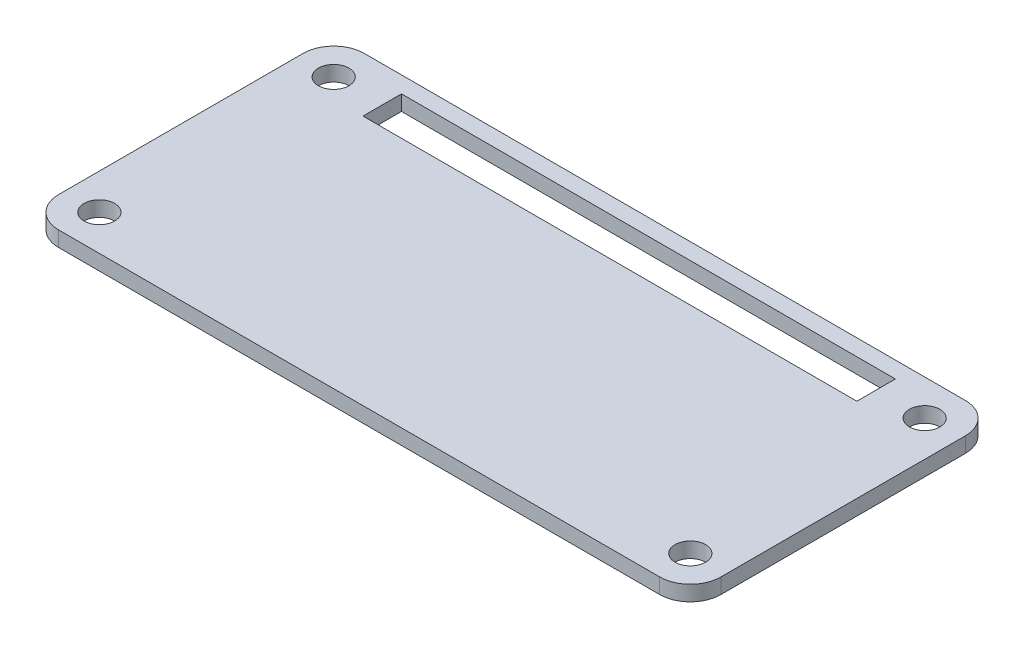
ISO-10303-21;
HEADER;
FILE_DESCRIPTION(('STEP AP214'),'2;1');
FILE_NAME('part.step','',(''),(''),'','','');
FILE_SCHEMA(('AUTOMOTIVE_DESIGN { 1 0 10303 214 1 1 1 1 }'));
ENDSEC;
DATA;
#1=APPLICATION_CONTEXT('core data for automotive mechanical design processes');
#2=APPLICATION_PROTOCOL_DEFINITION('international standard','automotive_design',2000,#1);
#3=PRODUCT_CONTEXT('',#1,'mechanical');
#4=PRODUCT('Part','Part','',(#3));
#5=PRODUCT_RELATED_PRODUCT_CATEGORY('part','',(#4));
#6=PRODUCT_DEFINITION_FORMATION('','',#4);
#7=PRODUCT_DEFINITION_CONTEXT('part definition',#1,'design');
#8=PRODUCT_DEFINITION('design','',#6,#7);
#9=PRODUCT_DEFINITION_SHAPE('','',#8);
#10=(LENGTH_UNIT() NAMED_UNIT(*) SI_UNIT(.MILLI.,.METRE.));
#11=(NAMED_UNIT(*) PLANE_ANGLE_UNIT() SI_UNIT($,.RADIAN.));
#12=(NAMED_UNIT(*) SI_UNIT($,.STERADIAN.) SOLID_ANGLE_UNIT());
#13=UNCERTAINTY_MEASURE_WITH_UNIT(LENGTH_MEASURE(1.E-05),#10,'distance_accuracy_value','');
#14=(GEOMETRIC_REPRESENTATION_CONTEXT(3) GLOBAL_UNCERTAINTY_ASSIGNED_CONTEXT((#13)) GLOBAL_UNIT_ASSIGNED_CONTEXT((#10,
#11,#12)) REPRESENTATION_CONTEXT('',''));
#15=CARTESIAN_POINT('',(0.,0.,0.));
#16=DIRECTION('',(0.,0.,1.));
#17=DIRECTION('',(1.,0.,0.));
#18=AXIS2_PLACEMENT_3D('',#15,#16,#17);
#19=CARTESIAN_POINT('',(29.5,1.5,12.));
#20=DIRECTION('',(0.,1.,0.));
#21=DIRECTION('',(0.,0.,1.));
#22=AXIS2_PLACEMENT_3D('',#19,#20,#21);
#23=PLANE('',#22);
#24=CARTESIAN_POINT('',(29.,1.5,11.5));
#25=DIRECTION('',(0.,1.,0.));
#26=DIRECTION('',(0.,0.,1.));
#27=AXIS2_PLACEMENT_3D('',#24,#25,#26);
#28=CIRCLE('',#27,1.5);
#29=CARTESIAN_POINT('',(29.,1.5,13.));
#30=VERTEX_POINT('',#29);
#31=EDGE_CURVE('E161',#30,#30,#28,.T.);
#32=ORIENTED_EDGE('',*,*,#31,.F.);
#33=EDGE_LOOP('',(#32));
#34=FACE_BOUND('',#33,.T.);
#35=CARTESIAN_POINT('',(-29.,1.5,-11.5));
#36=DIRECTION('',(0.,1.,0.));
#37=DIRECTION('',(0.,0.,1.));
#38=AXIS2_PLACEMENT_3D('',#35,#36,#37);
#39=CIRCLE('',#38,1.5);
#40=CARTESIAN_POINT('',(-29.,1.5,-10.));
#41=VERTEX_POINT('',#40);
#42=EDGE_CURVE('E173',#41,#41,#39,.T.);
#43=ORIENTED_EDGE('',*,*,#42,.F.);
#44=EDGE_LOOP('',(#43));
#45=FACE_BOUND('',#44,.T.);
#46=CARTESIAN_POINT('',(29.5,1.5,12.));
#47=DIRECTION('',(0.,1.,0.));
#48=DIRECTION('',(0.,0.,1.));
#49=AXIS2_PLACEMENT_3D('',#46,#47,#48);
#50=CIRCLE('',#49,3.);
#51=CARTESIAN_POINT('',(29.5,1.5,15.));
#52=VERTEX_POINT('',#51);
#53=CARTESIAN_POINT('',(32.5,1.5,12.));
#54=VERTEX_POINT('',#53);
#55=EDGE_CURVE('E179',#52,#54,#50,.T.);
#56=ORIENTED_EDGE('',*,*,#55,.T.);
#57=DIRECTION('',(0.,0.,-1.));
#58=VECTOR('',#57,1.);
#59=CARTESIAN_POINT('',(32.5,1.5,12.));
#60=LINE('',#59,#58);
#61=CARTESIAN_POINT('',(32.5,1.5,-12.));
#62=VERTEX_POINT('',#61);
#63=EDGE_CURVE('E182',#54,#62,#60,.T.);
#64=ORIENTED_EDGE('',*,*,#63,.T.);
#65=CARTESIAN_POINT('',(29.5,1.5,-12.));
#66=DIRECTION('',(0.,1.,0.));
#67=DIRECTION('',(0.,0.,1.));
#68=AXIS2_PLACEMENT_3D('',#65,#66,#67);
#69=CIRCLE('',#68,3.);
#70=CARTESIAN_POINT('',(29.5,1.5,-15.));
#71=VERTEX_POINT('',#70);
#72=EDGE_CURVE('E185',#62,#71,#69,.T.);
#73=ORIENTED_EDGE('',*,*,#72,.T.);
#74=DIRECTION('',(-1.,0.,0.));
#75=VECTOR('',#74,1.);
#76=CARTESIAN_POINT('',(29.5,1.5,-15.));
#77=LINE('',#76,#75);
#78=CARTESIAN_POINT('',(-29.5,1.5,-15.));
#79=VERTEX_POINT('',#78);
#80=EDGE_CURVE('E187',#71,#79,#77,.T.);
#81=ORIENTED_EDGE('',*,*,#80,.T.);
#82=CARTESIAN_POINT('',(-29.5,1.5,-12.));
#83=DIRECTION('',(0.,1.,0.));
#84=DIRECTION('',(0.,0.,1.));
#85=AXIS2_PLACEMENT_3D('',#82,#83,#84);
#86=CIRCLE('',#85,3.);
#87=CARTESIAN_POINT('',(-32.5,1.5,-12.));
#88=VERTEX_POINT('',#87);
#89=EDGE_CURVE('E189',#79,#88,#86,.T.);
#90=ORIENTED_EDGE('',*,*,#89,.T.);
#91=DIRECTION('',(0.,0.,1.));
#92=VECTOR('',#91,1.);
#93=CARTESIAN_POINT('',(-32.5,1.5,12.));
#94=LINE('',#93,#92);
#95=CARTESIAN_POINT('',(-32.5,1.5,12.));
#96=VERTEX_POINT('',#95);
#97=EDGE_CURVE('E191',#88,#96,#94,.T.);
#98=ORIENTED_EDGE('',*,*,#97,.T.);
#99=CARTESIAN_POINT('',(-29.5,1.5,12.));
#100=DIRECTION('',(0.,1.,0.));
#101=DIRECTION('',(0.,0.,-1.));
#102=AXIS2_PLACEMENT_3D('',#99,#100,#101);
#103=CIRCLE('',#102,3.);
#104=CARTESIAN_POINT('',(-29.5,1.5,15.));
#105=VERTEX_POINT('',#104);
#106=EDGE_CURVE('E193',#96,#105,#103,.T.);
#107=ORIENTED_EDGE('',*,*,#106,.T.);
#108=DIRECTION('',(1.,0.,0.));
#109=VECTOR('',#108,1.);
#110=CARTESIAN_POINT('',(29.5,1.5,15.));
#111=LINE('',#110,#109);
#112=EDGE_CURVE('E195',#105,#52,#111,.T.);
#113=ORIENTED_EDGE('',*,*,#112,.T.);
#114=EDGE_LOOP('',(#56,#64,#73,#81,#90,#98,#107,#113));
#115=FACE_BOUND('',#114,.T.);
#116=CARTESIAN_POINT('',(29.,1.5,-11.5));
#117=DIRECTION('',(0.,1.,0.));
#118=DIRECTION('',(0.,0.,1.));
#119=AXIS2_PLACEMENT_3D('',#116,#117,#118);
#120=CIRCLE('',#119,1.5);
#121=CARTESIAN_POINT('',(29.,1.5,-10.));
#122=VERTEX_POINT('',#121);
#123=EDGE_CURVE('E167',#122,#122,#120,.T.);
#124=ORIENTED_EDGE('',*,*,#123,.F.);
#125=EDGE_LOOP('',(#124));
#126=FACE_BOUND('',#125,.T.);
#127=CARTESIAN_POINT('',(-29.,1.5,11.5));
#128=DIRECTION('',(0.,1.,0.));
#129=DIRECTION('',(0.,0.,1.));
#130=AXIS2_PLACEMENT_3D('',#127,#128,#129);
#131=CIRCLE('',#130,1.5);
#132=CARTESIAN_POINT('',(-29.,1.5,13.));
#133=VERTEX_POINT('',#132);
#134=EDGE_CURVE('E155',#133,#133,#131,.T.);
#135=ORIENTED_EDGE('',*,*,#134,.F.);
#136=EDGE_LOOP('',(#135));
#137=FACE_BOUND('',#136,.T.);
#138=DIRECTION('',(1.,0.,0.));
#139=VECTOR('',#138,1.);
#140=CARTESIAN_POINT('',(24.2351311986602,1.5,-9.61048306153766));
#141=LINE('',#140,#139);
#142=CARTESIAN_POINT('',(-24.2351311986602,1.5,-9.61048306153766));
#143=VERTEX_POINT('',#142);
#144=CARTESIAN_POINT('',(24.2351311986602,1.5,-9.61048306153766));
#145=VERTEX_POINT('',#144);
#146=EDGE_CURVE('E127',#143,#145,#141,.T.);
#147=ORIENTED_EDGE('',*,*,#146,.F.);
#148=DIRECTION('',(0.,0.,1.));
#149=VECTOR('',#148,1.);
#150=CARTESIAN_POINT('',(-24.2351311986602,1.5,-13.3895169384623));
#151=LINE('',#150,#149);
#152=CARTESIAN_POINT('',(-24.2351311986602,1.5,-13.3895169384623));
#153=VERTEX_POINT('',#152);
#154=EDGE_CURVE('E119',#153,#143,#151,.T.);
#155=ORIENTED_EDGE('',*,*,#154,.F.);
#156=DIRECTION('',(-1.,0.,0.));
#157=VECTOR('',#156,1.);
#158=CARTESIAN_POINT('',(24.2351311986602,1.5,-13.3895169384623));
#159=LINE('',#158,#157);
#160=CARTESIAN_POINT('',(24.2351311986602,1.5,-13.3895169384623));
#161=VERTEX_POINT('',#160);
#162=EDGE_CURVE('E141',#161,#153,#159,.T.);
#163=ORIENTED_EDGE('',*,*,#162,.F.);
#164=DIRECTION('',(0.,0.,-1.));
#165=VECTOR('',#164,1.);
#166=CARTESIAN_POINT('',(24.2351311986602,1.5,-13.3895169384623));
#167=LINE('',#166,#165);
#168=EDGE_CURVE('E139',#145,#161,#167,.T.);
#169=ORIENTED_EDGE('',*,*,#168,.F.);
#170=EDGE_LOOP('',(#147,#155,#163,#169));
#171=FACE_BOUND('',#170,.T.);
#172=ADVANCED_FACE('F30',(#34,#45,#115,#126,#137,#171),#23,.T.);
#173=CARTESIAN_POINT('',(29.5,0.,12.));
#174=DIRECTION('',(0.,1.,0.));
#175=DIRECTION('',(0.,0.,1.));
#176=AXIS2_PLACEMENT_3D('',#173,#174,#175);
#177=PLANE('',#176);
#178=CARTESIAN_POINT('',(-29.,0.,11.5));
#179=DIRECTION('',(0.,1.,0.));
#180=DIRECTION('',(0.,0.,1.));
#181=AXIS2_PLACEMENT_3D('',#178,#179,#180);
#182=CIRCLE('',#181,1.5);
#183=CARTESIAN_POINT('',(-29.,0.,13.));
#184=VERTEX_POINT('',#183);
#185=EDGE_CURVE('E135',#184,#184,#182,.T.);
#186=ORIENTED_EDGE('',*,*,#185,.T.);
#187=EDGE_LOOP('',(#186));
#188=FACE_BOUND('',#187,.T.);
#189=CARTESIAN_POINT('',(29.,0.,11.5));
#190=DIRECTION('',(0.,1.,0.));
#191=DIRECTION('',(0.,0.,1.));
#192=AXIS2_PLACEMENT_3D('',#189,#190,#191);
#193=CIRCLE('',#192,1.5);
#194=CARTESIAN_POINT('',(29.,0.,13.));
#195=VERTEX_POINT('',#194);
#196=EDGE_CURVE('E158',#195,#195,#193,.T.);
#197=ORIENTED_EDGE('',*,*,#196,.T.);
#198=EDGE_LOOP('',(#197));
#199=FACE_BOUND('',#198,.T.);
#200=CARTESIAN_POINT('',(29.,0.,-11.5));
#201=DIRECTION('',(0.,1.,0.));
#202=DIRECTION('',(0.,0.,1.));
#203=AXIS2_PLACEMENT_3D('',#200,#201,#202);
#204=CIRCLE('',#203,1.5);
#205=CARTESIAN_POINT('',(29.,0.,-10.));
#206=VERTEX_POINT('',#205);
#207=EDGE_CURVE('E164',#206,#206,#204,.T.);
#208=ORIENTED_EDGE('',*,*,#207,.T.);
#209=EDGE_LOOP('',(#208));
#210=FACE_BOUND('',#209,.T.);
#211=CARTESIAN_POINT('',(-29.,0.,-11.5));
#212=DIRECTION('',(0.,1.,0.));
#213=DIRECTION('',(0.,0.,1.));
#214=AXIS2_PLACEMENT_3D('',#211,#212,#213);
#215=CIRCLE('',#214,1.5);
#216=CARTESIAN_POINT('',(-29.,0.,-10.));
#217=VERTEX_POINT('',#216);
#218=EDGE_CURVE('E170',#217,#217,#215,.T.);
#219=ORIENTED_EDGE('',*,*,#218,.T.);
#220=EDGE_LOOP('',(#219));
#221=FACE_BOUND('',#220,.T.);
#222=CARTESIAN_POINT('',(29.5,0.,12.));
#223=DIRECTION('',(0.,1.,0.));
#224=DIRECTION('',(0.,0.,1.));
#225=AXIS2_PLACEMENT_3D('',#222,#223,#224);
#226=CIRCLE('',#225,3.);
#227=CARTESIAN_POINT('',(29.5,0.,15.));
#228=VERTEX_POINT('',#227);
#229=CARTESIAN_POINT('',(32.5,0.,12.));
#230=VERTEX_POINT('',#229);
#231=EDGE_CURVE('E176',#228,#230,#226,.T.);
#232=ORIENTED_EDGE('',*,*,#231,.F.);
#233=DIRECTION('',(1.,0.,0.));
#234=VECTOR('',#233,1.);
#235=CARTESIAN_POINT('',(29.5,0.,15.));
#236=LINE('',#235,#234);
#237=CARTESIAN_POINT('',(-29.5,0.,15.));
#238=VERTEX_POINT('',#237);
#239=EDGE_CURVE('E183',#238,#228,#236,.T.);
#240=ORIENTED_EDGE('',*,*,#239,.F.);
#241=CARTESIAN_POINT('',(-29.5,0.,12.));
#242=DIRECTION('',(0.,1.,0.));
#243=DIRECTION('',(0.,0.,-1.));
#244=AXIS2_PLACEMENT_3D('',#241,#242,#243);
#245=CIRCLE('',#244,3.);
#246=CARTESIAN_POINT('',(-32.5,0.,12.));
#247=VERTEX_POINT('',#246);
#248=EDGE_CURVE('E210',#247,#238,#245,.T.);
#249=ORIENTED_EDGE('',*,*,#248,.F.);
#250=DIRECTION('',(0.,0.,1.));
#251=VECTOR('',#250,1.);
#252=CARTESIAN_POINT('',(-32.5,0.,12.));
#253=LINE('',#252,#251);
#254=CARTESIAN_POINT('',(-32.5,0.,-12.));
#255=VERTEX_POINT('',#254);
#256=EDGE_CURVE('E208',#255,#247,#253,.T.);
#257=ORIENTED_EDGE('',*,*,#256,.F.);
#258=CARTESIAN_POINT('',(-29.5,0.,-12.));
#259=DIRECTION('',(0.,1.,0.));
#260=DIRECTION('',(0.,0.,1.));
#261=AXIS2_PLACEMENT_3D('',#258,#259,#260);
#262=CIRCLE('',#261,3.);
#263=CARTESIAN_POINT('',(-29.5,0.,-15.));
#264=VERTEX_POINT('',#263);
#265=EDGE_CURVE('E206',#264,#255,#262,.T.);
#266=ORIENTED_EDGE('',*,*,#265,.F.);
#267=DIRECTION('',(-1.,0.,0.));
#268=VECTOR('',#267,1.);
#269=CARTESIAN_POINT('',(29.5,0.,-15.));
#270=LINE('',#269,#268);
#271=CARTESIAN_POINT('',(29.5,0.,-15.));
#272=VERTEX_POINT('',#271);
#273=EDGE_CURVE('E204',#272,#264,#270,.T.);
#274=ORIENTED_EDGE('',*,*,#273,.F.);
#275=CARTESIAN_POINT('',(29.5,0.,-12.));
#276=DIRECTION('',(0.,1.,0.));
#277=DIRECTION('',(0.,0.,1.));
#278=AXIS2_PLACEMENT_3D('',#275,#276,#277);
#279=CIRCLE('',#278,3.);
#280=CARTESIAN_POINT('',(32.5,0.,-12.));
#281=VERTEX_POINT('',#280);
#282=EDGE_CURVE('E202',#281,#272,#279,.T.);
#283=ORIENTED_EDGE('',*,*,#282,.F.);
#284=DIRECTION('',(0.,0.,-1.));
#285=VECTOR('',#284,1.);
#286=CARTESIAN_POINT('',(32.5,0.,12.));
#287=LINE('',#286,#285);
#288=EDGE_CURVE('E200',#230,#281,#287,.T.);
#289=ORIENTED_EDGE('',*,*,#288,.F.);
#290=EDGE_LOOP('',(#232,#240,#249,#257,#266,#274,#283,#289));
#291=FACE_BOUND('',#290,.T.);
#292=DIRECTION('',(0.,0.,1.));
#293=VECTOR('',#292,1.);
#294=CARTESIAN_POINT('',(-24.2351311986602,0.,-13.3895169384623));
#295=LINE('',#294,#293);
#296=CARTESIAN_POINT('',(-24.2351311986602,0.,-13.3895169384623));
#297=VERTEX_POINT('',#296);
#298=CARTESIAN_POINT('',(-24.2351311986602,0.,-9.61048306153766));
#299=VERTEX_POINT('',#298);
#300=EDGE_CURVE('E53',#297,#299,#295,.T.);
#301=ORIENTED_EDGE('',*,*,#300,.T.);
#302=DIRECTION('',(1.,0.,0.));
#303=VECTOR('',#302,1.);
#304=CARTESIAN_POINT('',(24.2351311986602,0.,-9.61048306153766));
#305=LINE('',#304,#303);
#306=CARTESIAN_POINT('',(24.2351311986602,0.,-9.61048306153766));
#307=VERTEX_POINT('',#306);
#308=EDGE_CURVE('E134',#299,#307,#305,.T.);
#309=ORIENTED_EDGE('',*,*,#308,.T.);
#310=DIRECTION('',(0.,0.,-1.));
#311=VECTOR('',#310,1.);
#312=CARTESIAN_POINT('',(24.2351311986602,0.,-13.3895169384623));
#313=LINE('',#312,#311);
#314=CARTESIAN_POINT('',(24.2351311986602,0.,-13.3895169384623));
#315=VERTEX_POINT('',#314);
#316=EDGE_CURVE('E147',#307,#315,#313,.T.);
#317=ORIENTED_EDGE('',*,*,#316,.T.);
#318=DIRECTION('',(-1.,0.,0.));
#319=VECTOR('',#318,1.);
#320=CARTESIAN_POINT('',(24.2351311986602,0.,-13.3895169384623));
#321=LINE('',#320,#319);
#322=EDGE_CURVE('E128',#315,#297,#321,.T.);
#323=ORIENTED_EDGE('',*,*,#322,.T.);
#324=EDGE_LOOP('',(#301,#309,#317,#323));
#325=FACE_BOUND('',#324,.T.);
#326=ADVANCED_FACE('F240',(#188,#199,#210,#221,#291,#325),#177,.F.);
#327=CARTESIAN_POINT('',(29.5,1.5,12.));
#328=DIRECTION('',(0.,-1.,0.));
#329=DIRECTION('',(0.,0.,-1.));
#330=AXIS2_PLACEMENT_3D('',#327,#328,#329);
#331=CYLINDRICAL_SURFACE('',#330,3.);
#332=ORIENTED_EDGE('',*,*,#231,.T.);
#333=DIRECTION('',(0.,-1.,0.));
#334=VECTOR('',#333,1.);
#335=CARTESIAN_POINT('',(32.5,1.5,12.));
#336=LINE('',#335,#334);
#337=EDGE_CURVE('E11',#54,#230,#336,.T.);
#338=ORIENTED_EDGE('',*,*,#337,.F.);
#339=ORIENTED_EDGE('',*,*,#55,.F.);
#340=DIRECTION('',(0.,-1.,0.));
#341=VECTOR('',#340,1.);
#342=CARTESIAN_POINT('',(29.5,1.5,15.));
#343=LINE('',#342,#341);
#344=EDGE_CURVE('E197',#52,#228,#343,.T.);
#345=ORIENTED_EDGE('',*,*,#344,.T.);
#346=EDGE_LOOP('',(#332,#338,#339,#345));
#347=FACE_BOUND('',#346,.T.);
#348=ADVANCED_FACE('F32',(#347),#331,.T.);
#349=CARTESIAN_POINT('',(32.5,1.5,12.));
#350=DIRECTION('',(-1.,0.,0.));
#351=DIRECTION('',(0.,0.,1.));
#352=AXIS2_PLACEMENT_3D('',#349,#350,#351);
#353=PLANE('',#352);
#354=ORIENTED_EDGE('',*,*,#288,.T.);
#355=DIRECTION('',(0.,-1.,0.));
#356=VECTOR('',#355,1.);
#357=CARTESIAN_POINT('',(32.5,1.5,-12.));
#358=LINE('',#357,#356);
#359=EDGE_CURVE('E38',#62,#281,#358,.T.);
#360=ORIENTED_EDGE('',*,*,#359,.F.);
#361=ORIENTED_EDGE('',*,*,#63,.F.);
#362=ORIENTED_EDGE('',*,*,#337,.T.);
#363=EDGE_LOOP('',(#354,#360,#361,#362));
#364=FACE_BOUND('',#363,.T.);
#365=ADVANCED_FACE('F258',(#364),#353,.F.);
#366=CARTESIAN_POINT('',(29.5,1.5,-12.));
#367=DIRECTION('',(0.,-1.,0.));
#368=DIRECTION('',(0.,0.,-1.));
#369=AXIS2_PLACEMENT_3D('',#366,#367,#368);
#370=CYLINDRICAL_SURFACE('',#369,3.);
#371=ORIENTED_EDGE('',*,*,#282,.T.);
#372=DIRECTION('',(0.,-1.,0.));
#373=VECTOR('',#372,1.);
#374=CARTESIAN_POINT('',(29.5,1.5,-15.));
#375=LINE('',#374,#373);
#376=EDGE_CURVE('E227',#71,#272,#375,.T.);
#377=ORIENTED_EDGE('',*,*,#376,.F.);
#378=ORIENTED_EDGE('',*,*,#72,.F.);
#379=ORIENTED_EDGE('',*,*,#359,.T.);
#380=EDGE_LOOP('',(#371,#377,#378,#379));
#381=FACE_BOUND('',#380,.T.);
#382=ADVANCED_FACE('F234',(#381),#370,.T.);
#383=CARTESIAN_POINT('',(29.5,1.5,-15.));
#384=DIRECTION('',(0.,0.,1.));
#385=DIRECTION('',(1.,0.,0.));
#386=AXIS2_PLACEMENT_3D('',#383,#384,#385);
#387=PLANE('',#386);
#388=ORIENTED_EDGE('',*,*,#273,.T.);
#389=DIRECTION('',(0.,-1.,0.));
#390=VECTOR('',#389,1.);
#391=CARTESIAN_POINT('',(-29.5,1.5,-15.));
#392=LINE('',#391,#390);
#393=EDGE_CURVE('E224',#79,#264,#392,.T.);
#394=ORIENTED_EDGE('',*,*,#393,.F.);
#395=ORIENTED_EDGE('',*,*,#80,.F.);
#396=ORIENTED_EDGE('',*,*,#376,.T.);
#397=EDGE_LOOP('',(#388,#394,#395,#396));
#398=FACE_BOUND('',#397,.T.);
#399=ADVANCED_FACE('F246',(#398),#387,.F.);
#400=CARTESIAN_POINT('',(-29.5,1.5,-12.));
#401=DIRECTION('',(0.,-1.,0.));
#402=DIRECTION('',(0.,0.,-1.));
#403=AXIS2_PLACEMENT_3D('',#400,#401,#402);
#404=CYLINDRICAL_SURFACE('',#403,3.);
#405=ORIENTED_EDGE('',*,*,#265,.T.);
#406=DIRECTION('',(0.,-1.,0.));
#407=VECTOR('',#406,1.);
#408=CARTESIAN_POINT('',(-32.5,1.5,-12.));
#409=LINE('',#408,#407);
#410=EDGE_CURVE('E221',#88,#255,#409,.T.);
#411=ORIENTED_EDGE('',*,*,#410,.F.);
#412=ORIENTED_EDGE('',*,*,#89,.F.);
#413=ORIENTED_EDGE('',*,*,#393,.T.);
#414=EDGE_LOOP('',(#405,#411,#412,#413));
#415=FACE_BOUND('',#414,.T.);
#416=ADVANCED_FACE('F250',(#415),#404,.T.);
#417=CARTESIAN_POINT('',(-32.5,1.5,12.));
#418=DIRECTION('',(1.,0.,0.));
#419=DIRECTION('',(0.,0.,-1.));
#420=AXIS2_PLACEMENT_3D('',#417,#418,#419);
#421=PLANE('',#420);
#422=ORIENTED_EDGE('',*,*,#256,.T.);
#423=DIRECTION('',(0.,-1.,0.));
#424=VECTOR('',#423,1.);
#425=CARTESIAN_POINT('',(-32.5,1.5,12.));
#426=LINE('',#425,#424);
#427=EDGE_CURVE('E218',#96,#247,#426,.T.);
#428=ORIENTED_EDGE('',*,*,#427,.F.);
#429=ORIENTED_EDGE('',*,*,#97,.F.);
#430=ORIENTED_EDGE('',*,*,#410,.T.);
#431=EDGE_LOOP('',(#422,#428,#429,#430));
#432=FACE_BOUND('',#431,.T.);
#433=ADVANCED_FACE('F271',(#432),#421,.F.);
#434=CARTESIAN_POINT('',(-29.5,1.5,12.));
#435=DIRECTION('',(0.,-1.,0.));
#436=DIRECTION('',(0.,0.,-1.));
#437=AXIS2_PLACEMENT_3D('',#434,#435,#436);
#438=CYLINDRICAL_SURFACE('',#437,3.);
#439=ORIENTED_EDGE('',*,*,#248,.T.);
#440=DIRECTION('',(0.,-1.,0.));
#441=VECTOR('',#440,1.);
#442=CARTESIAN_POINT('',(-29.5,1.5,15.));
#443=LINE('',#442,#441);
#444=EDGE_CURVE('E215',#105,#238,#443,.T.);
#445=ORIENTED_EDGE('',*,*,#444,.F.);
#446=ORIENTED_EDGE('',*,*,#106,.F.);
#447=ORIENTED_EDGE('',*,*,#427,.T.);
#448=EDGE_LOOP('',(#439,#445,#446,#447));
#449=FACE_BOUND('',#448,.T.);
#450=ADVANCED_FACE('F269',(#449),#438,.T.);
#451=CARTESIAN_POINT('',(29.5,1.5,15.));
#452=DIRECTION('',(0.,0.,-1.));
#453=DIRECTION('',(-1.,0.,0.));
#454=AXIS2_PLACEMENT_3D('',#451,#452,#453);
#455=PLANE('',#454);
#456=ORIENTED_EDGE('',*,*,#239,.T.);
#457=ORIENTED_EDGE('',*,*,#344,.F.);
#458=ORIENTED_EDGE('',*,*,#112,.F.);
#459=ORIENTED_EDGE('',*,*,#444,.T.);
#460=EDGE_LOOP('',(#456,#457,#458,#459));
#461=FACE_BOUND('',#460,.T.);
#462=ADVANCED_FACE('F264',(#461),#455,.F.);
#463=CARTESIAN_POINT('',(-29.,1.5,-11.5));
#464=DIRECTION('',(0.,-1.,0.));
#465=DIRECTION('',(0.,0.,-1.));
#466=AXIS2_PLACEMENT_3D('',#463,#464,#465);
#467=CYLINDRICAL_SURFACE('',#466,1.5);
#468=ORIENTED_EDGE('',*,*,#42,.T.);
#469=EDGE_LOOP('',(#468));
#470=FACE_BOUND('',#469,.T.);
#471=ORIENTED_EDGE('',*,*,#218,.F.);
#472=EDGE_LOOP('',(#471));
#473=FACE_BOUND('',#472,.T.);
#474=ADVANCED_FACE('F291',(#470,#473),#467,.F.);
#475=CARTESIAN_POINT('',(29.,1.5,-11.5));
#476=DIRECTION('',(0.,-1.,0.));
#477=DIRECTION('',(0.,0.,-1.));
#478=AXIS2_PLACEMENT_3D('',#475,#476,#477);
#479=CYLINDRICAL_SURFACE('',#478,1.5);
#480=ORIENTED_EDGE('',*,*,#123,.T.);
#481=EDGE_LOOP('',(#480));
#482=FACE_BOUND('',#481,.T.);
#483=ORIENTED_EDGE('',*,*,#207,.F.);
#484=EDGE_LOOP('',(#483));
#485=FACE_BOUND('',#484,.T.);
#486=ADVANCED_FACE('F298',(#482,#485),#479,.F.);
#487=CARTESIAN_POINT('',(29.,1.5,11.5));
#488=DIRECTION('',(0.,-1.,0.));
#489=DIRECTION('',(0.,0.,-1.));
#490=AXIS2_PLACEMENT_3D('',#487,#488,#489);
#491=CYLINDRICAL_SURFACE('',#490,1.5);
#492=ORIENTED_EDGE('',*,*,#31,.T.);
#493=EDGE_LOOP('',(#492));
#494=FACE_BOUND('',#493,.T.);
#495=ORIENTED_EDGE('',*,*,#196,.F.);
#496=EDGE_LOOP('',(#495));
#497=FACE_BOUND('',#496,.T.);
#498=ADVANCED_FACE('F303',(#494,#497),#491,.F.);
#499=CARTESIAN_POINT('',(-29.,1.5,11.5));
#500=DIRECTION('',(0.,-1.,0.));
#501=DIRECTION('',(0.,0.,-1.));
#502=AXIS2_PLACEMENT_3D('',#499,#500,#501);
#503=CYLINDRICAL_SURFACE('',#502,1.5);
#504=ORIENTED_EDGE('',*,*,#134,.T.);
#505=EDGE_LOOP('',(#504));
#506=FACE_BOUND('',#505,.T.);
#507=ORIENTED_EDGE('',*,*,#185,.F.);
#508=EDGE_LOOP('',(#507));
#509=FACE_BOUND('',#508,.T.);
#510=ADVANCED_FACE('F312',(#506,#509),#503,.F.);
#511=CARTESIAN_POINT('',(-24.2351311986602,1.5,-13.3895169384623));
#512=DIRECTION('',(1.,0.,0.));
#513=DIRECTION('',(0.,0.,-1.));
#514=AXIS2_PLACEMENT_3D('',#511,#512,#513);
#515=PLANE('',#514);
#516=ORIENTED_EDGE('',*,*,#300,.F.);
#517=DIRECTION('',(0.,-1.,0.));
#518=VECTOR('',#517,1.);
#519=CARTESIAN_POINT('',(-24.2351311986602,1.5,-13.3895169384623));
#520=LINE('',#519,#518);
#521=EDGE_CURVE('E123',#153,#297,#520,.T.);
#522=ORIENTED_EDGE('',*,*,#521,.F.);
#523=ORIENTED_EDGE('',*,*,#154,.T.);
#524=DIRECTION('',(0.,-1.,0.));
#525=VECTOR('',#524,1.);
#526=CARTESIAN_POINT('',(-24.2351311986602,1.5,-9.61048306153766));
#527=LINE('',#526,#525);
#528=EDGE_CURVE('E122',#143,#299,#527,.T.);
#529=ORIENTED_EDGE('',*,*,#528,.T.);
#530=EDGE_LOOP('',(#516,#522,#523,#529));
#531=FACE_BOUND('',#530,.T.);
#532=ADVANCED_FACE('F121',(#531),#515,.T.);
#533=CARTESIAN_POINT('',(24.2351311986602,1.5,-9.61048306153766));
#534=DIRECTION('',(0.,0.,-1.));
#535=DIRECTION('',(-1.,0.,0.));
#536=AXIS2_PLACEMENT_3D('',#533,#534,#535);
#537=PLANE('',#536);
#538=ORIENTED_EDGE('',*,*,#308,.F.);
#539=ORIENTED_EDGE('',*,*,#528,.F.);
#540=ORIENTED_EDGE('',*,*,#146,.T.);
#541=DIRECTION('',(0.,-1.,0.));
#542=VECTOR('',#541,1.);
#543=CARTESIAN_POINT('',(24.2351311986602,1.5,-9.61048306153766));
#544=LINE('',#543,#542);
#545=EDGE_CURVE('E136',#145,#307,#544,.T.);
#546=ORIENTED_EDGE('',*,*,#545,.T.);
#547=EDGE_LOOP('',(#538,#539,#540,#546));
#548=FACE_BOUND('',#547,.T.);
#549=ADVANCED_FACE('F131',(#548),#537,.T.);
#550=CARTESIAN_POINT('',(24.2351311986602,1.5,-13.3895169384623));
#551=DIRECTION('',(-1.,0.,0.));
#552=DIRECTION('',(0.,0.,1.));
#553=AXIS2_PLACEMENT_3D('',#550,#551,#552);
#554=PLANE('',#553);
#555=ORIENTED_EDGE('',*,*,#316,.F.);
#556=ORIENTED_EDGE('',*,*,#545,.F.);
#557=ORIENTED_EDGE('',*,*,#168,.T.);
#558=DIRECTION('',(0.,-1.,0.));
#559=VECTOR('',#558,1.);
#560=CARTESIAN_POINT('',(24.2351311986602,1.5,-13.3895169384623));
#561=LINE('',#560,#559);
#562=EDGE_CURVE('E45',#161,#315,#561,.T.);
#563=ORIENTED_EDGE('',*,*,#562,.T.);
#564=EDGE_LOOP('',(#555,#556,#557,#563));
#565=FACE_BOUND('',#564,.T.);
#566=ADVANCED_FACE('F324',(#565),#554,.T.);
#567=CARTESIAN_POINT('',(24.2351311986602,1.5,-13.3895169384623));
#568=DIRECTION('',(0.,0.,1.));
#569=DIRECTION('',(1.,0.,0.));
#570=AXIS2_PLACEMENT_3D('',#567,#568,#569);
#571=PLANE('',#570);
#572=ORIENTED_EDGE('',*,*,#322,.F.);
#573=ORIENTED_EDGE('',*,*,#562,.F.);
#574=ORIENTED_EDGE('',*,*,#162,.T.);
#575=ORIENTED_EDGE('',*,*,#521,.T.);
#576=EDGE_LOOP('',(#572,#573,#574,#575));
#577=FACE_BOUND('',#576,.T.);
#578=ADVANCED_FACE('F327',(#577),#571,.T.);
#579=CLOSED_SHELL('',(#172,#326,#348,#365,#382,#399,#416,#433,#450,#462,#474,#486,#498,#510,
#532,#549,#566,#578));
#580=MANIFOLD_SOLID_BREP('B2',#579);
#581=ADVANCED_BREP_SHAPE_REPRESENTATION('',(#18,#580),#14);
#582=SHAPE_DEFINITION_REPRESENTATION(#9,#581);
ENDSEC;
END-ISO-10303-21;
